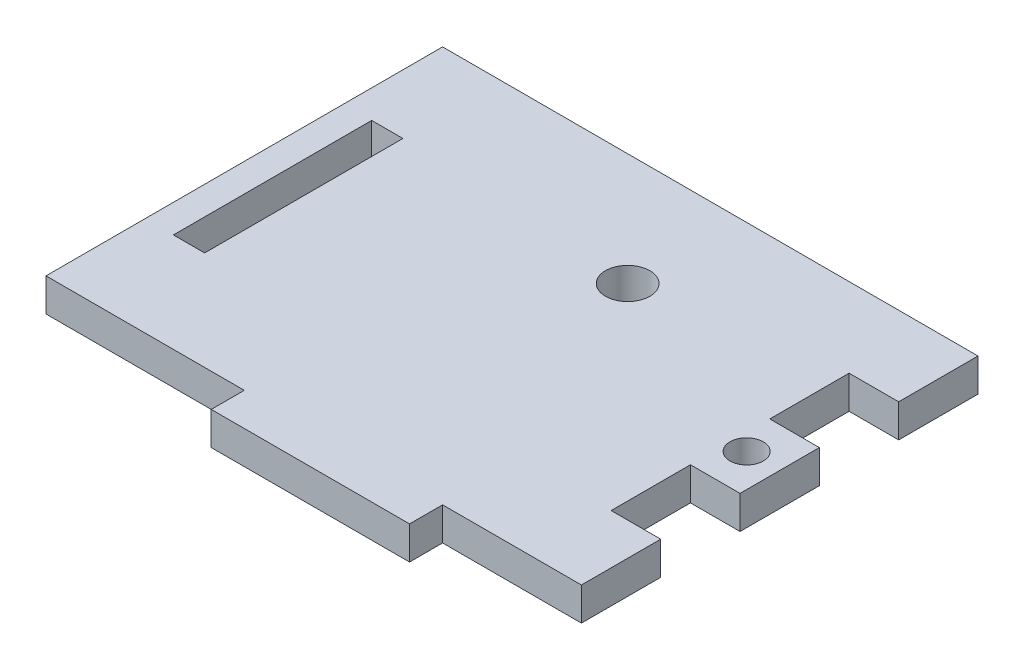
ISO-10303-21;
HEADER;
FILE_DESCRIPTION(('STEP AP214'),'2;1');
FILE_NAME('part.step','',(''),(''),'','','');
FILE_SCHEMA(('AUTOMOTIVE_DESIGN { 1 0 10303 214 1 1 1 1 }'));
ENDSEC;
DATA;
#1=APPLICATION_CONTEXT('core data for automotive mechanical design processes');
#2=APPLICATION_PROTOCOL_DEFINITION('international standard','automotive_design',2000,#1);
#3=PRODUCT_CONTEXT('',#1,'mechanical');
#4=PRODUCT('Part','Part','',(#3));
#5=PRODUCT_RELATED_PRODUCT_CATEGORY('part','',(#4));
#6=PRODUCT_DEFINITION_FORMATION('','',#4);
#7=PRODUCT_DEFINITION_CONTEXT('part definition',#1,'design');
#8=PRODUCT_DEFINITION('design','',#6,#7);
#9=PRODUCT_DEFINITION_SHAPE('','',#8);
#10=(LENGTH_UNIT() NAMED_UNIT(*) SI_UNIT(.MILLI.,.METRE.));
#11=(NAMED_UNIT(*) PLANE_ANGLE_UNIT() SI_UNIT($,.RADIAN.));
#12=(NAMED_UNIT(*) SI_UNIT($,.STERADIAN.) SOLID_ANGLE_UNIT());
#13=UNCERTAINTY_MEASURE_WITH_UNIT(LENGTH_MEASURE(1.E-05),#10,'distance_accuracy_value','');
#14=(GEOMETRIC_REPRESENTATION_CONTEXT(3) GLOBAL_UNCERTAINTY_ASSIGNED_CONTEXT((#13)) GLOBAL_UNIT_ASSIGNED_CONTEXT((#10,
#11,#12)) REPRESENTATION_CONTEXT('',''));
#15=CARTESIAN_POINT('',(0.,0.,0.));
#16=DIRECTION('',(0.,0.,1.));
#17=DIRECTION('',(1.,0.,0.));
#18=AXIS2_PLACEMENT_3D('',#15,#16,#17);
#19=CARTESIAN_POINT('',(0.,3.175,-38.1));
#20=DIRECTION('',(1.,0.,0.));
#21=DIRECTION('',(0.,0.,-1.));
#22=AXIS2_PLACEMENT_3D('',#19,#20,#21);
#23=PLANE('',#22);
#24=DIRECTION('',(0.,0.,1.));
#25=VECTOR('',#24,1.);
#26=CARTESIAN_POINT('',(0.,0.,-38.1));
#27=LINE('',#26,#25);
#28=CARTESIAN_POINT('',(0.,0.,-38.1));
#29=VERTEX_POINT('',#28);
#30=CARTESIAN_POINT('',(0.,0.,0.));
#31=VERTEX_POINT('',#30);
#32=EDGE_CURVE('E217',#29,#31,#27,.T.);
#33=ORIENTED_EDGE('',*,*,#32,.T.);
#34=DIRECTION('',(0.,-1.,0.));
#35=VECTOR('',#34,1.);
#36=CARTESIAN_POINT('',(0.,3.175,0.));
#37=LINE('',#36,#35);
#38=CARTESIAN_POINT('',(0.,3.175,0.));
#39=VERTEX_POINT('',#38);
#40=EDGE_CURVE('E11',#39,#31,#37,.T.);
#41=ORIENTED_EDGE('',*,*,#40,.F.);
#42=DIRECTION('',(0.,0.,1.));
#43=VECTOR('',#42,1.);
#44=CARTESIAN_POINT('',(0.,3.175,-38.1));
#45=LINE('',#44,#43);
#46=CARTESIAN_POINT('',(0.,3.175,-38.1));
#47=VERTEX_POINT('',#46);
#48=EDGE_CURVE('E218',#47,#39,#45,.T.);
#49=ORIENTED_EDGE('',*,*,#48,.F.);
#50=DIRECTION('',(0.,-1.,0.));
#51=VECTOR('',#50,1.);
#52=CARTESIAN_POINT('',(0.,3.175,-38.1));
#53=LINE('',#52,#51);
#54=EDGE_CURVE('E252',#47,#29,#53,.T.);
#55=ORIENTED_EDGE('',*,*,#54,.T.);
#56=EDGE_LOOP('',(#33,#41,#49,#55));
#57=FACE_BOUND('',#56,.T.);
#58=ADVANCED_FACE('F33',(#57),#23,.F.);
#59=CARTESIAN_POINT('',(0.,3.175,0.));
#60=DIRECTION('',(0.,0.,-1.));
#61=DIRECTION('',(-1.,0.,0.));
#62=AXIS2_PLACEMENT_3D('',#59,#60,#61);
#63=PLANE('',#62);
#64=DIRECTION('',(1.,0.,0.));
#65=VECTOR('',#64,1.);
#66=CARTESIAN_POINT('',(0.,0.,0.));
#67=LINE('',#66,#65);
#68=CARTESIAN_POINT('',(19.05,0.,0.));
#69=VERTEX_POINT('',#68);
#70=EDGE_CURVE('E255',#31,#69,#67,.T.);
#71=ORIENTED_EDGE('',*,*,#70,.T.);
#72=DIRECTION('',(0.,-1.,0.));
#73=VECTOR('',#72,1.);
#74=CARTESIAN_POINT('',(19.05,3.175,0.));
#75=LINE('',#74,#73);
#76=CARTESIAN_POINT('',(19.05,3.175,0.));
#77=VERTEX_POINT('',#76);
#78=EDGE_CURVE('E40',#77,#69,#75,.T.);
#79=ORIENTED_EDGE('',*,*,#78,.F.);
#80=DIRECTION('',(1.,0.,0.));
#81=VECTOR('',#80,1.);
#82=CARTESIAN_POINT('',(0.,3.175,0.));
#83=LINE('',#82,#81);
#84=EDGE_CURVE('E221',#39,#77,#83,.T.);
#85=ORIENTED_EDGE('',*,*,#84,.F.);
#86=ORIENTED_EDGE('',*,*,#40,.T.);
#87=EDGE_LOOP('',(#71,#79,#85,#86));
#88=FACE_BOUND('',#87,.T.);
#89=ADVANCED_FACE('F351',(#88),#63,.F.);
#90=CARTESIAN_POINT('',(19.05,3.175,0.));
#91=DIRECTION('',(1.,0.,0.));
#92=DIRECTION('',(0.,0.,-1.));
#93=AXIS2_PLACEMENT_3D('',#90,#91,#92);
#94=PLANE('',#93);
#95=DIRECTION('',(0.,0.,1.));
#96=VECTOR('',#95,1.);
#97=CARTESIAN_POINT('',(19.05,0.,0.));
#98=LINE('',#97,#96);
#99=CARTESIAN_POINT('',(19.05,0.,3.175));
#100=VERTEX_POINT('',#99);
#101=EDGE_CURVE('E257',#69,#100,#98,.T.);
#102=ORIENTED_EDGE('',*,*,#101,.T.);
#103=DIRECTION('',(0.,-1.,0.));
#104=VECTOR('',#103,1.);
#105=CARTESIAN_POINT('',(19.05,3.175,3.175));
#106=LINE('',#105,#104);
#107=CARTESIAN_POINT('',(19.05,3.175,3.175));
#108=VERTEX_POINT('',#107);
#109=EDGE_CURVE('E322',#108,#100,#106,.T.);
#110=ORIENTED_EDGE('',*,*,#109,.F.);
#111=DIRECTION('',(0.,0.,1.));
#112=VECTOR('',#111,1.);
#113=CARTESIAN_POINT('',(19.05,3.175,0.));
#114=LINE('',#113,#112);
#115=EDGE_CURVE('E224',#77,#108,#114,.T.);
#116=ORIENTED_EDGE('',*,*,#115,.F.);
#117=ORIENTED_EDGE('',*,*,#78,.T.);
#118=EDGE_LOOP('',(#102,#110,#116,#117));
#119=FACE_BOUND('',#118,.T.);
#120=ADVANCED_FACE('F329',(#119),#94,.F.);
#121=CARTESIAN_POINT('',(19.05,3.175,3.175));
#122=DIRECTION('',(0.,0.,-1.));
#123=DIRECTION('',(-1.,0.,0.));
#124=AXIS2_PLACEMENT_3D('',#121,#122,#123);
#125=PLANE('',#124);
#126=DIRECTION('',(1.,0.,0.));
#127=VECTOR('',#126,1.);
#128=CARTESIAN_POINT('',(19.05,0.,3.175));
#129=LINE('',#128,#127);
#130=CARTESIAN_POINT('',(38.1,0.,3.175));
#131=VERTEX_POINT('',#130);
#132=EDGE_CURVE('E259',#100,#131,#129,.T.);
#133=ORIENTED_EDGE('',*,*,#132,.T.);
#134=DIRECTION('',(0.,-1.,0.));
#135=VECTOR('',#134,1.);
#136=CARTESIAN_POINT('',(38.1,3.175,3.175));
#137=LINE('',#136,#135);
#138=CARTESIAN_POINT('',(38.1,3.175,3.175));
#139=VERTEX_POINT('',#138);
#140=EDGE_CURVE('E319',#139,#131,#137,.T.);
#141=ORIENTED_EDGE('',*,*,#140,.F.);
#142=DIRECTION('',(1.,0.,0.));
#143=VECTOR('',#142,1.);
#144=CARTESIAN_POINT('',(19.05,3.175,3.175));
#145=LINE('',#144,#143);
#146=EDGE_CURVE('E226',#108,#139,#145,.T.);
#147=ORIENTED_EDGE('',*,*,#146,.F.);
#148=ORIENTED_EDGE('',*,*,#109,.T.);
#149=EDGE_LOOP('',(#133,#141,#147,#148));
#150=FACE_BOUND('',#149,.T.);
#151=ADVANCED_FACE('F339',(#150),#125,.F.);
#152=CARTESIAN_POINT('',(38.1,3.175,3.175));
#153=DIRECTION('',(-1.,0.,0.));
#154=DIRECTION('',(0.,0.,1.));
#155=AXIS2_PLACEMENT_3D('',#152,#153,#154);
#156=PLANE('',#155);
#157=DIRECTION('',(0.,0.,-1.));
#158=VECTOR('',#157,1.);
#159=CARTESIAN_POINT('',(38.1,0.,3.175));
#160=LINE('',#159,#158);
#161=CARTESIAN_POINT('',(38.1,0.,0.));
#162=VERTEX_POINT('',#161);
#163=EDGE_CURVE('E261',#131,#162,#160,.T.);
#164=ORIENTED_EDGE('',*,*,#163,.T.);
#165=DIRECTION('',(0.,-1.,0.));
#166=VECTOR('',#165,1.);
#167=CARTESIAN_POINT('',(38.1,3.175,0.));
#168=LINE('',#167,#166);
#169=CARTESIAN_POINT('',(38.1,3.175,0.));
#170=VERTEX_POINT('',#169);
#171=EDGE_CURVE('E316',#170,#162,#168,.T.);
#172=ORIENTED_EDGE('',*,*,#171,.F.);
#173=DIRECTION('',(0.,0.,-1.));
#174=VECTOR('',#173,1.);
#175=CARTESIAN_POINT('',(38.1,3.175,3.175));
#176=LINE('',#175,#174);
#177=EDGE_CURVE('E228',#139,#170,#176,.T.);
#178=ORIENTED_EDGE('',*,*,#177,.F.);
#179=ORIENTED_EDGE('',*,*,#140,.T.);
#180=EDGE_LOOP('',(#164,#172,#178,#179));
#181=FACE_BOUND('',#180,.T.);
#182=ADVANCED_FACE('F343',(#181),#156,.F.);
#183=CARTESIAN_POINT('',(38.1,3.175,0.));
#184=DIRECTION('',(0.,0.,-1.));
#185=DIRECTION('',(-1.,0.,0.));
#186=AXIS2_PLACEMENT_3D('',#183,#184,#185);
#187=PLANE('',#186);
#188=DIRECTION('',(1.,0.,0.));
#189=VECTOR('',#188,1.);
#190=CARTESIAN_POINT('',(38.1,0.,0.));
#191=LINE('',#190,#189);
#192=CARTESIAN_POINT('',(51.435,0.,0.));
#193=VERTEX_POINT('',#192);
#194=EDGE_CURVE('E263',#162,#193,#191,.T.);
#195=ORIENTED_EDGE('',*,*,#194,.T.);
#196=DIRECTION('',(0.,-1.,0.));
#197=VECTOR('',#196,1.);
#198=CARTESIAN_POINT('',(51.435,3.175,0.));
#199=LINE('',#198,#197);
#200=CARTESIAN_POINT('',(51.435,3.175,0.));
#201=VERTEX_POINT('',#200);
#202=EDGE_CURVE('E313',#201,#193,#199,.T.);
#203=ORIENTED_EDGE('',*,*,#202,.F.);
#204=DIRECTION('',(1.,0.,0.));
#205=VECTOR('',#204,1.);
#206=CARTESIAN_POINT('',(38.1,3.175,0.));
#207=LINE('',#206,#205);
#208=EDGE_CURVE('E230',#170,#201,#207,.T.);
#209=ORIENTED_EDGE('',*,*,#208,.F.);
#210=ORIENTED_EDGE('',*,*,#171,.T.);
#211=EDGE_LOOP('',(#195,#203,#209,#210));
#212=FACE_BOUND('',#211,.T.);
#213=ADVANCED_FACE('F404',(#212),#187,.F.);
#214=CARTESIAN_POINT('',(51.435,3.175,0.));
#215=DIRECTION('',(-1.,0.,0.));
#216=DIRECTION('',(0.,0.,1.));
#217=AXIS2_PLACEMENT_3D('',#214,#215,#216);
#218=PLANE('',#217);
#219=DIRECTION('',(0.,0.,-1.));
#220=VECTOR('',#219,1.);
#221=CARTESIAN_POINT('',(51.435,0.,0.));
#222=LINE('',#221,#220);
#223=CARTESIAN_POINT('',(51.435,0.,-7.62));
#224=VERTEX_POINT('',#223);
#225=EDGE_CURVE('E265',#193,#224,#222,.T.);
#226=ORIENTED_EDGE('',*,*,#225,.T.);
#227=DIRECTION('',(0.,-1.,0.));
#228=VECTOR('',#227,1.);
#229=CARTESIAN_POINT('',(51.435,3.175,-7.62));
#230=LINE('',#229,#228);
#231=CARTESIAN_POINT('',(51.435,3.175,-7.62));
#232=VERTEX_POINT('',#231);
#233=EDGE_CURVE('E310',#232,#224,#230,.T.);
#234=ORIENTED_EDGE('',*,*,#233,.F.);
#235=DIRECTION('',(0.,0.,-1.));
#236=VECTOR('',#235,1.);
#237=CARTESIAN_POINT('',(51.435,3.175,0.));
#238=LINE('',#237,#236);
#239=EDGE_CURVE('E232',#201,#232,#238,.T.);
#240=ORIENTED_EDGE('',*,*,#239,.F.);
#241=ORIENTED_EDGE('',*,*,#202,.T.);
#242=EDGE_LOOP('',(#226,#234,#240,#241));
#243=FACE_BOUND('',#242,.T.);
#244=ADVANCED_FACE('F401',(#243),#218,.F.);
#245=CARTESIAN_POINT('',(46.6725,3.175,-7.62));
#246=DIRECTION('',(0.,0.,1.));
#247=DIRECTION('',(1.,0.,0.));
#248=AXIS2_PLACEMENT_3D('',#245,#246,#247);
#249=PLANE('',#248);
#250=DIRECTION('',(-1.,0.,0.));
#251=VECTOR('',#250,1.);
#252=CARTESIAN_POINT('',(46.6725,0.,-7.62));
#253=LINE('',#252,#251);
#254=CARTESIAN_POINT('',(46.6725,0.,-7.62));
#255=VERTEX_POINT('',#254);
#256=EDGE_CURVE('E267',#224,#255,#253,.T.);
#257=ORIENTED_EDGE('',*,*,#256,.T.);
#258=DIRECTION('',(0.,-1.,0.));
#259=VECTOR('',#258,1.);
#260=CARTESIAN_POINT('',(46.6725,3.175,-7.62));
#261=LINE('',#260,#259);
#262=CARTESIAN_POINT('',(46.6725,3.175,-7.62));
#263=VERTEX_POINT('',#262);
#264=EDGE_CURVE('E307',#263,#255,#261,.T.);
#265=ORIENTED_EDGE('',*,*,#264,.F.);
#266=DIRECTION('',(-1.,0.,0.));
#267=VECTOR('',#266,1.);
#268=CARTESIAN_POINT('',(46.6725,3.175,-7.62));
#269=LINE('',#268,#267);
#270=EDGE_CURVE('E234',#232,#263,#269,.T.);
#271=ORIENTED_EDGE('',*,*,#270,.F.);
#272=ORIENTED_EDGE('',*,*,#233,.T.);
#273=EDGE_LOOP('',(#257,#265,#271,#272));
#274=FACE_BOUND('',#273,.T.);
#275=ADVANCED_FACE('F397',(#274),#249,.F.);
#276=CARTESIAN_POINT('',(46.6725,3.175,-15.24));
#277=DIRECTION('',(-1.,0.,0.));
#278=DIRECTION('',(0.,0.,1.));
#279=AXIS2_PLACEMENT_3D('',#276,#277,#278);
#280=PLANE('',#279);
#281=DIRECTION('',(0.,0.,-1.));
#282=VECTOR('',#281,1.);
#283=CARTESIAN_POINT('',(46.6725,0.,-15.24));
#284=LINE('',#283,#282);
#285=CARTESIAN_POINT('',(46.6725,0.,-15.24));
#286=VERTEX_POINT('',#285);
#287=EDGE_CURVE('E269',#255,#286,#284,.T.);
#288=ORIENTED_EDGE('',*,*,#287,.T.);
#289=DIRECTION('',(0.,-1.,0.));
#290=VECTOR('',#289,1.);
#291=CARTESIAN_POINT('',(46.6725,3.175,-15.24));
#292=LINE('',#291,#290);
#293=CARTESIAN_POINT('',(46.6725,3.175,-15.24));
#294=VERTEX_POINT('',#293);
#295=EDGE_CURVE('E304',#294,#286,#292,.T.);
#296=ORIENTED_EDGE('',*,*,#295,.F.);
#297=DIRECTION('',(0.,0.,-1.));
#298=VECTOR('',#297,1.);
#299=CARTESIAN_POINT('',(46.6725,3.175,-15.24));
#300=LINE('',#299,#298);
#301=EDGE_CURVE('E236',#263,#294,#300,.T.);
#302=ORIENTED_EDGE('',*,*,#301,.F.);
#303=ORIENTED_EDGE('',*,*,#264,.T.);
#304=EDGE_LOOP('',(#288,#296,#302,#303));
#305=FACE_BOUND('',#304,.T.);
#306=ADVANCED_FACE('F393',(#305),#280,.F.);
#307=CARTESIAN_POINT('',(46.6725,3.175,-15.24));
#308=DIRECTION('',(0.,0.,-1.));
#309=DIRECTION('',(-1.,0.,0.));
#310=AXIS2_PLACEMENT_3D('',#307,#308,#309);
#311=PLANE('',#310);
#312=DIRECTION('',(1.,0.,0.));
#313=VECTOR('',#312,1.);
#314=CARTESIAN_POINT('',(46.6725,0.,-15.24));
#315=LINE('',#314,#313);
#316=CARTESIAN_POINT('',(51.435,0.,-15.24));
#317=VERTEX_POINT('',#316);
#318=EDGE_CURVE('E271',#286,#317,#315,.T.);
#319=ORIENTED_EDGE('',*,*,#318,.T.);
#320=DIRECTION('',(0.,-1.,0.));
#321=VECTOR('',#320,1.);
#322=CARTESIAN_POINT('',(51.435,3.175,-15.24));
#323=LINE('',#322,#321);
#324=CARTESIAN_POINT('',(51.435,3.175,-15.24));
#325=VERTEX_POINT('',#324);
#326=EDGE_CURVE('E301',#325,#317,#323,.T.);
#327=ORIENTED_EDGE('',*,*,#326,.F.);
#328=DIRECTION('',(1.,0.,0.));
#329=VECTOR('',#328,1.);
#330=CARTESIAN_POINT('',(46.6725,3.175,-15.24));
#331=LINE('',#330,#329);
#332=EDGE_CURVE('E238',#294,#325,#331,.T.);
#333=ORIENTED_EDGE('',*,*,#332,.F.);
#334=ORIENTED_EDGE('',*,*,#295,.T.);
#335=EDGE_LOOP('',(#319,#327,#333,#334));
#336=FACE_BOUND('',#335,.T.);
#337=ADVANCED_FACE('F388',(#336),#311,.F.);
#338=CARTESIAN_POINT('',(51.435,3.175,-15.24));
#339=DIRECTION('',(-1.,0.,0.));
#340=DIRECTION('',(0.,0.,1.));
#341=AXIS2_PLACEMENT_3D('',#338,#339,#340);
#342=PLANE('',#341);
#343=DIRECTION('',(0.,0.,-1.));
#344=VECTOR('',#343,1.);
#345=CARTESIAN_POINT('',(51.435,0.,-15.24));
#346=LINE('',#345,#344);
#347=CARTESIAN_POINT('',(51.435,0.,-22.86));
#348=VERTEX_POINT('',#347);
#349=EDGE_CURVE('E273',#317,#348,#346,.T.);
#350=ORIENTED_EDGE('',*,*,#349,.T.);
#351=DIRECTION('',(0.,-1.,0.));
#352=VECTOR('',#351,1.);
#353=CARTESIAN_POINT('',(51.435,3.175,-22.86));
#354=LINE('',#353,#352);
#355=CARTESIAN_POINT('',(51.435,3.175,-22.86));
#356=VERTEX_POINT('',#355);
#357=EDGE_CURVE('E298',#356,#348,#354,.T.);
#358=ORIENTED_EDGE('',*,*,#357,.F.);
#359=DIRECTION('',(0.,0.,-1.));
#360=VECTOR('',#359,1.);
#361=CARTESIAN_POINT('',(51.435,3.175,-15.24));
#362=LINE('',#361,#360);
#363=EDGE_CURVE('E240',#325,#356,#362,.T.);
#364=ORIENTED_EDGE('',*,*,#363,.F.);
#365=ORIENTED_EDGE('',*,*,#326,.T.);
#366=EDGE_LOOP('',(#350,#358,#364,#365));
#367=FACE_BOUND('',#366,.T.);
#368=ADVANCED_FACE('F382',(#367),#342,.F.);
#369=CARTESIAN_POINT('',(46.6725,3.175,-22.86));
#370=DIRECTION('',(0.,0.,1.));
#371=DIRECTION('',(1.,0.,0.));
#372=AXIS2_PLACEMENT_3D('',#369,#370,#371);
#373=PLANE('',#372);
#374=DIRECTION('',(-1.,0.,0.));
#375=VECTOR('',#374,1.);
#376=CARTESIAN_POINT('',(46.6725,0.,-22.86));
#377=LINE('',#376,#375);
#378=CARTESIAN_POINT('',(46.6725,0.,-22.86));
#379=VERTEX_POINT('',#378);
#380=EDGE_CURVE('E275',#348,#379,#377,.T.);
#381=ORIENTED_EDGE('',*,*,#380,.T.);
#382=DIRECTION('',(0.,-1.,0.));
#383=VECTOR('',#382,1.);
#384=CARTESIAN_POINT('',(46.6725,3.175,-22.86));
#385=LINE('',#384,#383);
#386=CARTESIAN_POINT('',(46.6725,3.175,-22.86));
#387=VERTEX_POINT('',#386);
#388=EDGE_CURVE('E295',#387,#379,#385,.T.);
#389=ORIENTED_EDGE('',*,*,#388,.F.);
#390=DIRECTION('',(-1.,0.,0.));
#391=VECTOR('',#390,1.);
#392=CARTESIAN_POINT('',(46.6725,3.175,-22.86));
#393=LINE('',#392,#391);
#394=EDGE_CURVE('E242',#356,#387,#393,.T.);
#395=ORIENTED_EDGE('',*,*,#394,.F.);
#396=ORIENTED_EDGE('',*,*,#357,.T.);
#397=EDGE_LOOP('',(#381,#389,#395,#396));
#398=FACE_BOUND('',#397,.T.);
#399=ADVANCED_FACE('F378',(#398),#373,.F.);
#400=CARTESIAN_POINT('',(46.6725,3.175,-30.48));
#401=DIRECTION('',(-1.,0.,0.));
#402=DIRECTION('',(0.,0.,1.));
#403=AXIS2_PLACEMENT_3D('',#400,#401,#402);
#404=PLANE('',#403);
#405=DIRECTION('',(0.,0.,-1.));
#406=VECTOR('',#405,1.);
#407=CARTESIAN_POINT('',(46.6725,0.,-30.48));
#408=LINE('',#407,#406);
#409=CARTESIAN_POINT('',(46.6725,0.,-30.48));
#410=VERTEX_POINT('',#409);
#411=EDGE_CURVE('E277',#379,#410,#408,.T.);
#412=ORIENTED_EDGE('',*,*,#411,.T.);
#413=DIRECTION('',(0.,-1.,0.));
#414=VECTOR('',#413,1.);
#415=CARTESIAN_POINT('',(46.6725,3.175,-30.48));
#416=LINE('',#415,#414);
#417=CARTESIAN_POINT('',(46.6725,3.175,-30.48));
#418=VERTEX_POINT('',#417);
#419=EDGE_CURVE('E292',#418,#410,#416,.T.);
#420=ORIENTED_EDGE('',*,*,#419,.F.);
#421=DIRECTION('',(0.,0.,-1.));
#422=VECTOR('',#421,1.);
#423=CARTESIAN_POINT('',(46.6725,3.175,-30.48));
#424=LINE('',#423,#422);
#425=EDGE_CURVE('E244',#387,#418,#424,.T.);
#426=ORIENTED_EDGE('',*,*,#425,.F.);
#427=ORIENTED_EDGE('',*,*,#388,.T.);
#428=EDGE_LOOP('',(#412,#420,#426,#427));
#429=FACE_BOUND('',#428,.T.);
#430=ADVANCED_FACE('F373',(#429),#404,.F.);
#431=CARTESIAN_POINT('',(46.6725,3.175,-30.48));
#432=DIRECTION('',(0.,0.,-1.));
#433=DIRECTION('',(-1.,0.,0.));
#434=AXIS2_PLACEMENT_3D('',#431,#432,#433);
#435=PLANE('',#434);
#436=DIRECTION('',(1.,0.,0.));
#437=VECTOR('',#436,1.);
#438=CARTESIAN_POINT('',(46.6725,0.,-30.48));
#439=LINE('',#438,#437);
#440=CARTESIAN_POINT('',(51.435,0.,-30.48));
#441=VERTEX_POINT('',#440);
#442=EDGE_CURVE('E279',#410,#441,#439,.T.);
#443=ORIENTED_EDGE('',*,*,#442,.T.);
#444=DIRECTION('',(0.,-1.,0.));
#445=VECTOR('',#444,1.);
#446=CARTESIAN_POINT('',(51.435,3.175,-30.48));
#447=LINE('',#446,#445);
#448=CARTESIAN_POINT('',(51.435,3.175,-30.48));
#449=VERTEX_POINT('',#448);
#450=EDGE_CURVE('E289',#449,#441,#447,.T.);
#451=ORIENTED_EDGE('',*,*,#450,.F.);
#452=DIRECTION('',(1.,0.,0.));
#453=VECTOR('',#452,1.);
#454=CARTESIAN_POINT('',(46.6725,3.175,-30.48));
#455=LINE('',#454,#453);
#456=EDGE_CURVE('E246',#418,#449,#455,.T.);
#457=ORIENTED_EDGE('',*,*,#456,.F.);
#458=ORIENTED_EDGE('',*,*,#419,.T.);
#459=EDGE_LOOP('',(#443,#451,#457,#458));
#460=FACE_BOUND('',#459,.T.);
#461=ADVANCED_FACE('F367',(#460),#435,.F.);
#462=CARTESIAN_POINT('',(51.435,3.175,-30.48));
#463=DIRECTION('',(-1.,0.,0.));
#464=DIRECTION('',(0.,0.,1.));
#465=AXIS2_PLACEMENT_3D('',#462,#463,#464);
#466=PLANE('',#465);
#467=DIRECTION('',(0.,0.,-1.));
#468=VECTOR('',#467,1.);
#469=CARTESIAN_POINT('',(51.435,0.,-30.48));
#470=LINE('',#469,#468);
#471=CARTESIAN_POINT('',(51.435,0.,-38.1));
#472=VERTEX_POINT('',#471);
#473=EDGE_CURVE('E281',#441,#472,#470,.T.);
#474=ORIENTED_EDGE('',*,*,#473,.T.);
#475=DIRECTION('',(0.,-1.,0.));
#476=VECTOR('',#475,1.);
#477=CARTESIAN_POINT('',(51.435,3.175,-38.1));
#478=LINE('',#477,#476);
#479=CARTESIAN_POINT('',(51.435,3.175,-38.1));
#480=VERTEX_POINT('',#479);
#481=EDGE_CURVE('E286',#480,#472,#478,.T.);
#482=ORIENTED_EDGE('',*,*,#481,.F.);
#483=DIRECTION('',(0.,0.,-1.));
#484=VECTOR('',#483,1.);
#485=CARTESIAN_POINT('',(51.435,3.175,-30.48));
#486=LINE('',#485,#484);
#487=EDGE_CURVE('E248',#449,#480,#486,.T.);
#488=ORIENTED_EDGE('',*,*,#487,.F.);
#489=ORIENTED_EDGE('',*,*,#450,.T.);
#490=EDGE_LOOP('',(#474,#482,#488,#489));
#491=FACE_BOUND('',#490,.T.);
#492=ADVANCED_FACE('F363',(#491),#466,.F.);
#493=CARTESIAN_POINT('',(51.435,3.175,-38.1));
#494=DIRECTION('',(0.,0.,1.));
#495=DIRECTION('',(1.,0.,0.));
#496=AXIS2_PLACEMENT_3D('',#493,#494,#495);
#497=PLANE('',#496);
#498=DIRECTION('',(-1.,0.,0.));
#499=VECTOR('',#498,1.);
#500=CARTESIAN_POINT('',(51.435,0.,-38.1));
#501=LINE('',#500,#499);
#502=EDGE_CURVE('E222',#472,#29,#501,.T.);
#503=ORIENTED_EDGE('',*,*,#502,.T.);
#504=ORIENTED_EDGE('',*,*,#54,.F.);
#505=DIRECTION('',(-1.,0.,0.));
#506=VECTOR('',#505,1.);
#507=CARTESIAN_POINT('',(51.435,3.175,-38.1));
#508=LINE('',#507,#506);
#509=EDGE_CURVE('E250',#480,#47,#508,.T.);
#510=ORIENTED_EDGE('',*,*,#509,.F.);
#511=ORIENTED_EDGE('',*,*,#481,.T.);
#512=EDGE_LOOP('',(#503,#504,#510,#511));
#513=FACE_BOUND('',#512,.T.);
#514=ADVANCED_FACE('F358',(#513),#497,.F.);
#515=CARTESIAN_POINT('',(0.,3.175,0.));
#516=DIRECTION('',(0.,1.,0.));
#517=DIRECTION('',(0.,0.,1.));
#518=AXIS2_PLACEMENT_3D('',#515,#516,#517);
#519=PLANE('',#518);
#520=DIRECTION('',(0.,0.,1.));
#521=VECTOR('',#520,1.);
#522=CARTESIAN_POINT('',(2.715,3.175,-28.575));
#523=LINE('',#522,#521);
#524=CARTESIAN_POINT('',(2.715,3.175,-28.575));
#525=VERTEX_POINT('',#524);
#526=CARTESIAN_POINT('',(2.715,3.175,-9.525));
#527=VERTEX_POINT('',#526);
#528=EDGE_CURVE('E47',#525,#527,#523,.T.);
#529=ORIENTED_EDGE('',*,*,#528,.F.);
#530=DIRECTION('',(-1.,0.,0.));
#531=VECTOR('',#530,1.);
#532=CARTESIAN_POINT('',(2.715,3.175,-28.575));
#533=LINE('',#532,#531);
#534=CARTESIAN_POINT('',(5.715,3.175,-28.575));
#535=VERTEX_POINT('',#534);
#536=EDGE_CURVE('E187',#535,#525,#533,.T.);
#537=ORIENTED_EDGE('',*,*,#536,.F.);
#538=DIRECTION('',(0.,0.,-1.));
#539=VECTOR('',#538,1.);
#540=CARTESIAN_POINT('',(5.715,3.175,-28.575));
#541=LINE('',#540,#539);
#542=CARTESIAN_POINT('',(5.715,3.175,-9.525));
#543=VERTEX_POINT('',#542);
#544=EDGE_CURVE('E190',#543,#535,#541,.T.);
#545=ORIENTED_EDGE('',*,*,#544,.F.);
#546=DIRECTION('',(1.,0.,0.));
#547=VECTOR('',#546,1.);
#548=CARTESIAN_POINT('',(2.715,3.175,-9.525));
#549=LINE('',#548,#547);
#550=EDGE_CURVE('E196',#527,#543,#549,.T.);
#551=ORIENTED_EDGE('',*,*,#550,.F.);
#552=EDGE_LOOP('',(#529,#537,#545,#551));
#553=FACE_BOUND('',#552,.T.);
#554=CARTESIAN_POINT('',(28.575,3.175,-27.305));
#555=DIRECTION('',(0.,1.,0.));
#556=DIRECTION('',(0.,0.,1.));
#557=AXIS2_PLACEMENT_3D('',#554,#555,#556);
#558=CIRCLE('',#557,2.13359999999999);
#559=CARTESIAN_POINT('',(28.575,3.175,-25.1714));
#560=VERTEX_POINT('',#559);
#561=EDGE_CURVE('E202',#560,#560,#558,.T.);
#562=ORIENTED_EDGE('',*,*,#561,.F.);
#563=EDGE_LOOP('',(#562));
#564=FACE_BOUND('',#563,.T.);
#565=CARTESIAN_POINT('',(48.26,3.175,-19.05));
#566=DIRECTION('',(0.,1.,0.));
#567=DIRECTION('',(0.,0.,1.));
#568=AXIS2_PLACEMENT_3D('',#565,#566,#567);
#569=CIRCLE('',#568,1.6);
#570=CARTESIAN_POINT('',(48.26,3.175,-17.45));
#571=VERTEX_POINT('',#570);
#572=EDGE_CURVE('E209',#571,#571,#569,.T.);
#573=ORIENTED_EDGE('',*,*,#572,.F.);
#574=EDGE_LOOP('',(#573));
#575=FACE_BOUND('',#574,.T.);
#576=ORIENTED_EDGE('',*,*,#48,.T.);
#577=ORIENTED_EDGE('',*,*,#84,.T.);
#578=ORIENTED_EDGE('',*,*,#115,.T.);
#579=ORIENTED_EDGE('',*,*,#146,.T.);
#580=ORIENTED_EDGE('',*,*,#177,.T.);
#581=ORIENTED_EDGE('',*,*,#208,.T.);
#582=ORIENTED_EDGE('',*,*,#239,.T.);
#583=ORIENTED_EDGE('',*,*,#270,.T.);
#584=ORIENTED_EDGE('',*,*,#301,.T.);
#585=ORIENTED_EDGE('',*,*,#332,.T.);
#586=ORIENTED_EDGE('',*,*,#363,.T.);
#587=ORIENTED_EDGE('',*,*,#394,.T.);
#588=ORIENTED_EDGE('',*,*,#425,.T.);
#589=ORIENTED_EDGE('',*,*,#456,.T.);
#590=ORIENTED_EDGE('',*,*,#487,.T.);
#591=ORIENTED_EDGE('',*,*,#509,.T.);
#592=EDGE_LOOP('',(#576,#577,#578,#579,#580,#581,#582,#583,#584,#585,#586,#587,#588,#589,#590,#591));
#593=FACE_BOUND('',#592,.T.);
#594=ADVANCED_FACE('F347',(#553,#564,#575,#593),#519,.T.);
#595=CARTESIAN_POINT('',(0.,0.,0.));
#596=DIRECTION('',(0.,1.,0.));
#597=DIRECTION('',(0.,0.,1.));
#598=AXIS2_PLACEMENT_3D('',#595,#596,#597);
#599=PLANE('',#598);
#600=DIRECTION('',(-1.,0.,0.));
#601=VECTOR('',#600,1.);
#602=CARTESIAN_POINT('',(2.715,0.,-28.575));
#603=LINE('',#602,#601);
#604=CARTESIAN_POINT('',(5.715,0.,-28.575));
#605=VERTEX_POINT('',#604);
#606=CARTESIAN_POINT('',(2.715,0.,-28.575));
#607=VERTEX_POINT('',#606);
#608=EDGE_CURVE('E177',#605,#607,#603,.T.);
#609=ORIENTED_EDGE('',*,*,#608,.T.);
#610=DIRECTION('',(0.,0.,1.));
#611=VECTOR('',#610,1.);
#612=CARTESIAN_POINT('',(2.715,0.,-28.575));
#613=LINE('',#612,#611);
#614=CARTESIAN_POINT('',(2.715,0.,-9.525));
#615=VERTEX_POINT('',#614);
#616=EDGE_CURVE('E171',#607,#615,#613,.T.);
#617=ORIENTED_EDGE('',*,*,#616,.T.);
#618=DIRECTION('',(1.,0.,0.));
#619=VECTOR('',#618,1.);
#620=CARTESIAN_POINT('',(2.715,0.,-9.525));
#621=LINE('',#620,#619);
#622=CARTESIAN_POINT('',(5.715,0.,-9.525));
#623=VERTEX_POINT('',#622);
#624=EDGE_CURVE('E180',#615,#623,#621,.T.);
#625=ORIENTED_EDGE('',*,*,#624,.T.);
#626=DIRECTION('',(0.,0.,-1.));
#627=VECTOR('',#626,1.);
#628=CARTESIAN_POINT('',(5.715,0.,-28.575));
#629=LINE('',#628,#627);
#630=EDGE_CURVE('E55',#623,#605,#629,.T.);
#631=ORIENTED_EDGE('',*,*,#630,.T.);
#632=EDGE_LOOP('',(#609,#617,#625,#631));
#633=FACE_BOUND('',#632,.T.);
#634=CARTESIAN_POINT('',(28.575,0.,-27.305));
#635=DIRECTION('',(0.,1.,0.));
#636=DIRECTION('',(0.,0.,1.));
#637=AXIS2_PLACEMENT_3D('',#634,#635,#636);
#638=CIRCLE('',#637,2.13359999999999);
#639=CARTESIAN_POINT('',(28.575,0.,-25.1714));
#640=VERTEX_POINT('',#639);
#641=EDGE_CURVE('E206',#640,#640,#638,.T.);
#642=ORIENTED_EDGE('',*,*,#641,.T.);
#643=EDGE_LOOP('',(#642));
#644=FACE_BOUND('',#643,.T.);
#645=CARTESIAN_POINT('',(48.26,0.,-19.05));
#646=DIRECTION('',(0.,1.,0.));
#647=DIRECTION('',(0.,0.,1.));
#648=AXIS2_PLACEMENT_3D('',#645,#646,#647);
#649=CIRCLE('',#648,1.6);
#650=CARTESIAN_POINT('',(48.26,0.,-17.45));
#651=VERTEX_POINT('',#650);
#652=EDGE_CURVE('E214',#651,#651,#649,.T.);
#653=ORIENTED_EDGE('',*,*,#652,.T.);
#654=EDGE_LOOP('',(#653));
#655=FACE_BOUND('',#654,.T.);
#656=ORIENTED_EDGE('',*,*,#32,.F.);
#657=ORIENTED_EDGE('',*,*,#502,.F.);
#658=ORIENTED_EDGE('',*,*,#473,.F.);
#659=ORIENTED_EDGE('',*,*,#442,.F.);
#660=ORIENTED_EDGE('',*,*,#411,.F.);
#661=ORIENTED_EDGE('',*,*,#380,.F.);
#662=ORIENTED_EDGE('',*,*,#349,.F.);
#663=ORIENTED_EDGE('',*,*,#318,.F.);
#664=ORIENTED_EDGE('',*,*,#287,.F.);
#665=ORIENTED_EDGE('',*,*,#256,.F.);
#666=ORIENTED_EDGE('',*,*,#225,.F.);
#667=ORIENTED_EDGE('',*,*,#194,.F.);
#668=ORIENTED_EDGE('',*,*,#163,.F.);
#669=ORIENTED_EDGE('',*,*,#132,.F.);
#670=ORIENTED_EDGE('',*,*,#101,.F.);
#671=ORIENTED_EDGE('',*,*,#70,.F.);
#672=EDGE_LOOP('',(#656,#657,#658,#659,#660,#661,#662,#663,#664,#665,#666,#667,#668,#669,#670,#671));
#673=FACE_BOUND('',#672,.T.);
#674=ADVANCED_FACE('F184',(#633,#644,#655,#673),#599,.F.);
#675=CARTESIAN_POINT('',(48.26,3.175,-19.05));
#676=DIRECTION('',(0.,1.,0.));
#677=DIRECTION('',(0.,0.,1.));
#678=AXIS2_PLACEMENT_3D('',#675,#676,#677);
#679=CYLINDRICAL_SURFACE('',#678,1.6);
#680=ORIENTED_EDGE('',*,*,#652,.F.);
#681=EDGE_LOOP('',(#680));
#682=FACE_BOUND('',#681,.T.);
#683=ORIENTED_EDGE('',*,*,#572,.T.);
#684=EDGE_LOOP('',(#683));
#685=FACE_BOUND('',#684,.T.);
#686=ADVANCED_FACE('F520',(#682,#685),#679,.F.);
#687=CARTESIAN_POINT('',(28.575,0.,-27.305));
#688=DIRECTION('',(0.,1.,0.));
#689=DIRECTION('',(0.,0.,1.));
#690=AXIS2_PLACEMENT_3D('',#687,#688,#689);
#691=CYLINDRICAL_SURFACE('',#690,2.13359999999999);
#692=ORIENTED_EDGE('',*,*,#641,.F.);
#693=EDGE_LOOP('',(#692));
#694=FACE_BOUND('',#693,.T.);
#695=ORIENTED_EDGE('',*,*,#561,.T.);
#696=EDGE_LOOP('',(#695));
#697=FACE_BOUND('',#696,.T.);
#698=ADVANCED_FACE('F525',(#694,#697),#691,.F.);
#699=CARTESIAN_POINT('',(2.715,0.,-28.575));
#700=DIRECTION('',(-1.,0.,0.));
#701=DIRECTION('',(0.,0.,1.));
#702=AXIS2_PLACEMENT_3D('',#699,#700,#701);
#703=PLANE('',#702);
#704=ORIENTED_EDGE('',*,*,#528,.T.);
#705=DIRECTION('',(0.,1.,0.));
#706=VECTOR('',#705,1.);
#707=CARTESIAN_POINT('',(2.715,0.,-9.525));
#708=LINE('',#707,#706);
#709=EDGE_CURVE('E167',#615,#527,#708,.T.);
#710=ORIENTED_EDGE('',*,*,#709,.F.);
#711=ORIENTED_EDGE('',*,*,#616,.F.);
#712=DIRECTION('',(0.,1.,0.));
#713=VECTOR('',#712,1.);
#714=CARTESIAN_POINT('',(2.715,0.,-28.575));
#715=LINE('',#714,#713);
#716=EDGE_CURVE('E200',#607,#525,#715,.T.);
#717=ORIENTED_EDGE('',*,*,#716,.T.);
#718=EDGE_LOOP('',(#704,#710,#711,#717));
#719=FACE_BOUND('',#718,.T.);
#720=ADVANCED_FACE('F169',(#719),#703,.F.);
#721=CARTESIAN_POINT('',(2.715,0.,-28.575));
#722=DIRECTION('',(0.,0.,-1.));
#723=DIRECTION('',(-1.,0.,0.));
#724=AXIS2_PLACEMENT_3D('',#721,#722,#723);
#725=PLANE('',#724);
#726=ORIENTED_EDGE('',*,*,#536,.T.);
#727=ORIENTED_EDGE('',*,*,#716,.F.);
#728=ORIENTED_EDGE('',*,*,#608,.F.);
#729=DIRECTION('',(0.,1.,0.));
#730=VECTOR('',#729,1.);
#731=CARTESIAN_POINT('',(5.715,0.,-28.575));
#732=LINE('',#731,#730);
#733=EDGE_CURVE('E203',#605,#535,#732,.T.);
#734=ORIENTED_EDGE('',*,*,#733,.T.);
#735=EDGE_LOOP('',(#726,#727,#728,#734));
#736=FACE_BOUND('',#735,.T.);
#737=ADVANCED_FACE('F563',(#736),#725,.F.);
#738=CARTESIAN_POINT('',(5.715,0.,-28.575));
#739=DIRECTION('',(1.,0.,0.));
#740=DIRECTION('',(0.,0.,-1.));
#741=AXIS2_PLACEMENT_3D('',#738,#739,#740);
#742=PLANE('',#741);
#743=ORIENTED_EDGE('',*,*,#544,.T.);
#744=ORIENTED_EDGE('',*,*,#733,.F.);
#745=ORIENTED_EDGE('',*,*,#630,.F.);
#746=DIRECTION('',(0.,1.,0.));
#747=VECTOR('',#746,1.);
#748=CARTESIAN_POINT('',(5.715,0.,-9.525));
#749=LINE('',#748,#747);
#750=EDGE_CURVE('E176',#623,#543,#749,.T.);
#751=ORIENTED_EDGE('',*,*,#750,.T.);
#752=EDGE_LOOP('',(#743,#744,#745,#751));
#753=FACE_BOUND('',#752,.T.);
#754=ADVANCED_FACE('F572',(#753),#742,.F.);
#755=CARTESIAN_POINT('',(2.715,0.,-9.525));
#756=DIRECTION('',(0.,0.,1.));
#757=DIRECTION('',(1.,0.,0.));
#758=AXIS2_PLACEMENT_3D('',#755,#756,#757);
#759=PLANE('',#758);
#760=ORIENTED_EDGE('',*,*,#550,.T.);
#761=ORIENTED_EDGE('',*,*,#750,.F.);
#762=ORIENTED_EDGE('',*,*,#624,.F.);
#763=ORIENTED_EDGE('',*,*,#709,.T.);
#764=EDGE_LOOP('',(#760,#761,#762,#763));
#765=FACE_BOUND('',#764,.T.);
#766=ADVANCED_FACE('F181',(#765),#759,.F.);
#767=CLOSED_SHELL('',(#58,#89,#120,#151,#182,#213,#244,#275,#306,#337,#368,#399,#430,#461,#492,
#514,#594,#674,#686,#698,#720,#737,#754,#766));
#768=MANIFOLD_SOLID_BREP('B2',#767);
#769=ADVANCED_BREP_SHAPE_REPRESENTATION('',(#18,#768),#14);
#770=SHAPE_DEFINITION_REPRESENTATION(#9,#769);
ENDSEC;
END-ISO-10303-21;
